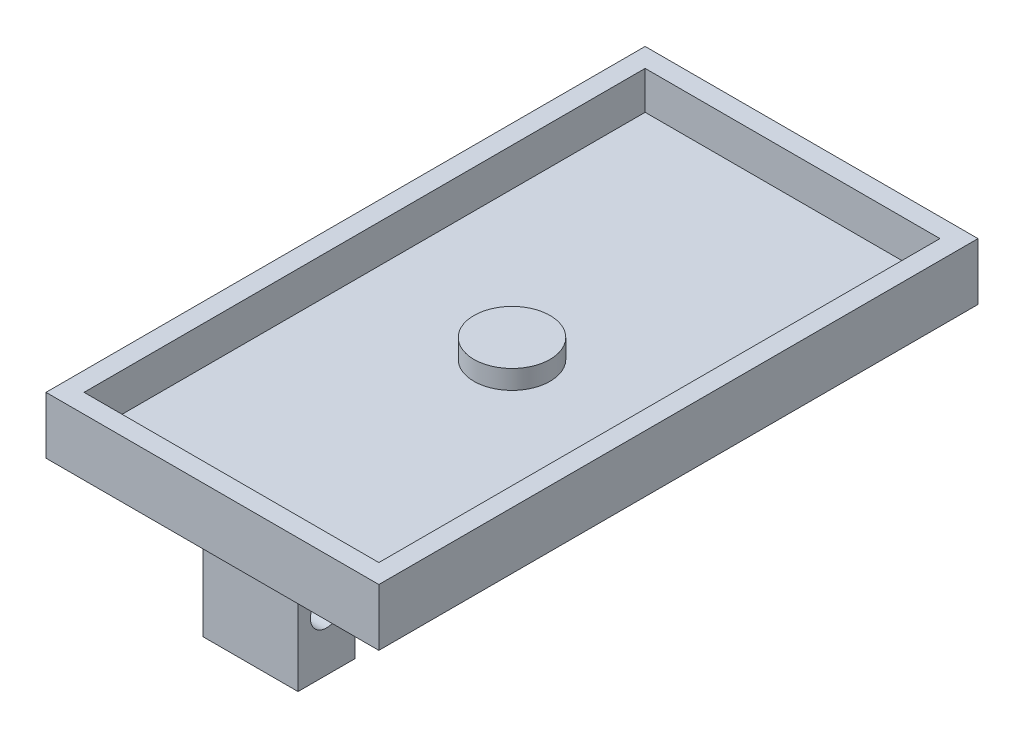
ISO-10303-21;
HEADER;
FILE_DESCRIPTION(('STEP AP214'),'2;1');
FILE_NAME('part.step','',(''),(''),'','','');
FILE_SCHEMA(('AUTOMOTIVE_DESIGN { 1 0 10303 214 1 1 1 1 }'));
ENDSEC;
DATA;
#1=APPLICATION_CONTEXT('core data for automotive mechanical design processes');
#2=APPLICATION_PROTOCOL_DEFINITION('international standard','automotive_design',2000,#1);
#3=PRODUCT_CONTEXT('',#1,'mechanical');
#4=PRODUCT('Part','Part','',(#3));
#5=PRODUCT_RELATED_PRODUCT_CATEGORY('part','',(#4));
#6=PRODUCT_DEFINITION_FORMATION('','',#4);
#7=PRODUCT_DEFINITION_CONTEXT('part definition',#1,'design');
#8=PRODUCT_DEFINITION('design','',#6,#7);
#9=PRODUCT_DEFINITION_SHAPE('','',#8);
#10=(LENGTH_UNIT() NAMED_UNIT(*) SI_UNIT(.MILLI.,.METRE.));
#11=(NAMED_UNIT(*) PLANE_ANGLE_UNIT() SI_UNIT($,.RADIAN.));
#12=(NAMED_UNIT(*) SI_UNIT($,.STERADIAN.) SOLID_ANGLE_UNIT());
#13=UNCERTAINTY_MEASURE_WITH_UNIT(LENGTH_MEASURE(1.E-05),#10,'distance_accuracy_value','');
#14=(GEOMETRIC_REPRESENTATION_CONTEXT(3) GLOBAL_UNCERTAINTY_ASSIGNED_CONTEXT((#13)) GLOBAL_UNIT_ASSIGNED_CONTEXT((#10,
#11,#12)) REPRESENTATION_CONTEXT('',''));
#15=CARTESIAN_POINT('',(0.,0.,0.));
#16=DIRECTION('',(0.,0.,1.));
#17=DIRECTION('',(1.,0.,0.));
#18=AXIS2_PLACEMENT_3D('',#15,#16,#17);
#19=CARTESIAN_POINT('',(17.5,2.,-31.5));
#20=DIRECTION('',(-1.,0.,0.));
#21=DIRECTION('',(0.,0.,1.));
#22=AXIS2_PLACEMENT_3D('',#19,#20,#21);
#23=PLANE('',#22);
#24=DIRECTION('',(0.,0.,-1.));
#25=VECTOR('',#24,1.);
#26=CARTESIAN_POINT('',(17.5,0.,-31.5));
#27=LINE('',#26,#25);
#28=CARTESIAN_POINT('',(17.5,0.,31.5));
#29=VERTEX_POINT('',#28);
#30=CARTESIAN_POINT('',(17.5,0.,-31.5));
#31=VERTEX_POINT('',#30);
#32=EDGE_CURVE('E328',#29,#31,#27,.T.);
#33=ORIENTED_EDGE('',*,*,#32,.T.);
#34=DIRECTION('',(0.,-1.,0.));
#35=VECTOR('',#34,1.);
#36=CARTESIAN_POINT('',(17.5,2.,-31.5));
#37=LINE('',#36,#35);
#38=CARTESIAN_POINT('',(17.5,6.,-31.5));
#39=VERTEX_POINT('',#38);
#40=EDGE_CURVE('E356',#39,#31,#37,.T.);
#41=ORIENTED_EDGE('',*,*,#40,.F.);
#42=DIRECTION('',(0.,0.,-1.));
#43=VECTOR('',#42,1.);
#44=CARTESIAN_POINT('',(17.5,6.,0.));
#45=LINE('',#44,#43);
#46=CARTESIAN_POINT('',(17.5,6.,31.5));
#47=VERTEX_POINT('',#46);
#48=EDGE_CURVE('E205',#47,#39,#45,.T.);
#49=ORIENTED_EDGE('',*,*,#48,.F.);
#50=DIRECTION('',(0.,-1.,0.));
#51=VECTOR('',#50,1.);
#52=CARTESIAN_POINT('',(17.5,2.,31.5));
#53=LINE('',#52,#51);
#54=EDGE_CURVE('E343',#47,#29,#53,.T.);
#55=ORIENTED_EDGE('',*,*,#54,.T.);
#56=EDGE_LOOP('',(#33,#41,#49,#55));
#57=FACE_BOUND('',#56,.T.);
#58=ADVANCED_FACE('F41',(#57),#23,.F.);
#59=CARTESIAN_POINT('',(-17.5,2.,-31.5));
#60=DIRECTION('',(0.,0.,1.));
#61=DIRECTION('',(1.,0.,0.));
#62=AXIS2_PLACEMENT_3D('',#59,#60,#61);
#63=PLANE('',#62);
#64=DIRECTION('',(-1.,0.,0.));
#65=VECTOR('',#64,1.);
#66=CARTESIAN_POINT('',(-17.5,0.,-31.5));
#67=LINE('',#66,#65);
#68=CARTESIAN_POINT('',(-17.5,0.,-31.5));
#69=VERTEX_POINT('',#68);
#70=EDGE_CURVE('E332',#31,#69,#67,.T.);
#71=ORIENTED_EDGE('',*,*,#70,.T.);
#72=DIRECTION('',(0.,-1.,0.));
#73=VECTOR('',#72,1.);
#74=CARTESIAN_POINT('',(-17.5,2.,-31.5));
#75=LINE('',#74,#73);
#76=CARTESIAN_POINT('',(-17.5,6.,-31.5));
#77=VERTEX_POINT('',#76);
#78=EDGE_CURVE('E352',#77,#69,#75,.T.);
#79=ORIENTED_EDGE('',*,*,#78,.F.);
#80=DIRECTION('',(-1.,0.,0.));
#81=VECTOR('',#80,1.);
#82=CARTESIAN_POINT('',(0.,6.,-31.5));
#83=LINE('',#82,#81);
#84=EDGE_CURVE('E209',#39,#77,#83,.T.);
#85=ORIENTED_EDGE('',*,*,#84,.F.);
#86=ORIENTED_EDGE('',*,*,#40,.T.);
#87=EDGE_LOOP('',(#71,#79,#85,#86));
#88=FACE_BOUND('',#87,.T.);
#89=ADVANCED_FACE('F429',(#88),#63,.F.);
#90=CARTESIAN_POINT('',(-17.5,2.,-31.5));
#91=DIRECTION('',(1.,0.,0.));
#92=DIRECTION('',(0.,0.,-1.));
#93=AXIS2_PLACEMENT_3D('',#90,#91,#92);
#94=PLANE('',#93);
#95=DIRECTION('',(0.,0.,1.));
#96=VECTOR('',#95,1.);
#97=CARTESIAN_POINT('',(-17.5,0.,-31.5));
#98=LINE('',#97,#96);
#99=CARTESIAN_POINT('',(-17.5,0.,31.5));
#100=VERTEX_POINT('',#99);
#101=EDGE_CURVE('E335',#69,#100,#98,.T.);
#102=ORIENTED_EDGE('',*,*,#101,.T.);
#103=DIRECTION('',(0.,-1.,0.));
#104=VECTOR('',#103,1.);
#105=CARTESIAN_POINT('',(-17.5,2.,31.5));
#106=LINE('',#105,#104);
#107=CARTESIAN_POINT('',(-17.5,6.,31.5));
#108=VERTEX_POINT('',#107);
#109=EDGE_CURVE('E348',#108,#100,#106,.T.);
#110=ORIENTED_EDGE('',*,*,#109,.F.);
#111=DIRECTION('',(0.,0.,1.));
#112=VECTOR('',#111,1.);
#113=CARTESIAN_POINT('',(-17.5,6.,0.));
#114=LINE('',#113,#112);
#115=EDGE_CURVE('E213',#77,#108,#114,.T.);
#116=ORIENTED_EDGE('',*,*,#115,.F.);
#117=ORIENTED_EDGE('',*,*,#78,.T.);
#118=EDGE_LOOP('',(#102,#110,#116,#117));
#119=FACE_BOUND('',#118,.T.);
#120=ADVANCED_FACE('F432',(#119),#94,.F.);
#121=CARTESIAN_POINT('',(-17.5,2.,31.5));
#122=DIRECTION('',(0.,0.,-1.));
#123=DIRECTION('',(-1.,0.,0.));
#124=AXIS2_PLACEMENT_3D('',#121,#122,#123);
#125=PLANE('',#124);
#126=DIRECTION('',(1.,0.,0.));
#127=VECTOR('',#126,1.);
#128=CARTESIAN_POINT('',(-17.5,0.,31.5));
#129=LINE('',#128,#127);
#130=CARTESIAN_POINT('',(-5.,0.,31.5));
#131=VERTEX_POINT('',#130);
#132=EDGE_CURVE('E339',#100,#131,#129,.T.);
#133=ORIENTED_EDGE('',*,*,#132,.T.);
#134=CARTESIAN_POINT('',(5.,0.,31.5));
#135=VERTEX_POINT('',#134);
#136=EDGE_CURVE('E344',#131,#135,#129,.T.);
#137=ORIENTED_EDGE('',*,*,#136,.T.);
#138=EDGE_CURVE('E338',#135,#29,#129,.T.);
#139=ORIENTED_EDGE('',*,*,#138,.T.);
#140=ORIENTED_EDGE('',*,*,#54,.F.);
#141=DIRECTION('',(1.,0.,0.));
#142=VECTOR('',#141,1.);
#143=CARTESIAN_POINT('',(0.,6.,31.5));
#144=LINE('',#143,#142);
#145=EDGE_CURVE('E201',#108,#47,#144,.T.);
#146=ORIENTED_EDGE('',*,*,#145,.F.);
#147=ORIENTED_EDGE('',*,*,#109,.T.);
#148=EDGE_LOOP('',(#133,#137,#139,#140,#146,#147));
#149=FACE_BOUND('',#148,.T.);
#150=ADVANCED_FACE('F406',(#149),#125,.F.);
#151=CARTESIAN_POINT('',(0.,0.,0.));
#152=DIRECTION('',(0.,1.,0.));
#153=DIRECTION('',(0.,0.,1.));
#154=AXIS2_PLACEMENT_3D('',#151,#152,#153);
#155=PLANE('',#154);
#156=DIRECTION('',(-1.,0.,0.));
#157=VECTOR('',#156,1.);
#158=CARTESIAN_POINT('',(0.,0.,-11.5));
#159=LINE('',#158,#157);
#160=CARTESIAN_POINT('',(5.,0.,-11.5));
#161=VERTEX_POINT('',#160);
#162=CARTESIAN_POINT('',(-5.,0.,-11.5));
#163=VERTEX_POINT('',#162);
#164=EDGE_CURVE('E364',#161,#163,#159,.T.);
#165=ORIENTED_EDGE('',*,*,#164,.T.);
#166=DIRECTION('',(0.,0.,-1.));
#167=VECTOR('',#166,1.);
#168=CARTESIAN_POINT('',(-5.,0.,0.));
#169=LINE('',#168,#167);
#170=CARTESIAN_POINT('',(-5.,0.,-1.50000000000001));
#171=VERTEX_POINT('',#170);
#172=EDGE_CURVE('E256',#171,#163,#169,.T.);
#173=ORIENTED_EDGE('',*,*,#172,.F.);
#174=DIRECTION('',(1.,0.,0.));
#175=VECTOR('',#174,1.);
#176=CARTESIAN_POINT('',(0.,0.,-1.50000000000001));
#177=LINE('',#176,#175);
#178=CARTESIAN_POINT('',(5.,0.,-1.50000000000001));
#179=VERTEX_POINT('',#178);
#180=EDGE_CURVE('E270',#171,#179,#177,.T.);
#181=ORIENTED_EDGE('',*,*,#180,.T.);
#182=DIRECTION('',(0.,0.,-1.));
#183=VECTOR('',#182,1.);
#184=CARTESIAN_POINT('',(5.,0.,0.));
#185=LINE('',#184,#183);
#186=EDGE_CURVE('E244',#179,#161,#185,.T.);
#187=ORIENTED_EDGE('',*,*,#186,.T.);
#188=EDGE_LOOP('',(#165,#173,#181,#187));
#189=FACE_BOUND('',#188,.T.);
#190=DIRECTION('',(0.,0.,1.));
#191=VECTOR('',#190,1.);
#192=CARTESIAN_POINT('',(-5.,0.,0.));
#193=LINE('',#192,#191);
#194=CARTESIAN_POINT('',(-5.,0.,21.5));
#195=VERTEX_POINT('',#194);
#196=EDGE_CURVE('E289',#195,#131,#193,.T.);
#197=ORIENTED_EDGE('',*,*,#196,.T.);
#198=ORIENTED_EDGE('',*,*,#132,.F.);
#199=ORIENTED_EDGE('',*,*,#101,.F.);
#200=ORIENTED_EDGE('',*,*,#70,.F.);
#201=ORIENTED_EDGE('',*,*,#32,.F.);
#202=ORIENTED_EDGE('',*,*,#138,.F.);
#203=DIRECTION('',(0.,0.,1.));
#204=VECTOR('',#203,1.);
#205=CARTESIAN_POINT('',(5.,0.,0.));
#206=LINE('',#205,#204);
#207=CARTESIAN_POINT('',(5.,0.,21.5));
#208=VERTEX_POINT('',#207);
#209=EDGE_CURVE('E295',#208,#135,#206,.T.);
#210=ORIENTED_EDGE('',*,*,#209,.F.);
#211=DIRECTION('',(1.,0.,0.));
#212=VECTOR('',#211,1.);
#213=CARTESIAN_POINT('',(0.,0.,21.5));
#214=LINE('',#213,#212);
#215=EDGE_CURVE('E307',#195,#208,#214,.T.);
#216=ORIENTED_EDGE('',*,*,#215,.F.);
#217=EDGE_LOOP('',(#197,#198,#199,#200,#201,#202,#210,#216));
#218=FACE_BOUND('',#217,.T.);
#219=ADVANCED_FACE('F402',(#189,#218),#155,.F.);
#220=CARTESIAN_POINT('',(-5.,-12.,0.));
#221=DIRECTION('',(-1.,0.,0.));
#222=DIRECTION('',(0.,0.,1.));
#223=AXIS2_PLACEMENT_3D('',#220,#221,#222);
#224=PLANE('',#223);
#225=CARTESIAN_POINT('',(-5.,-6.00000000000001,24.5));
#226=DIRECTION('',(1.,0.,0.));
#227=DIRECTION('',(0.,0.,-1.));
#228=AXIS2_PLACEMENT_3D('',#225,#226,#227);
#229=CIRCLE('',#228,1.7);
#230=CARTESIAN_POINT('',(-5.,-6.00000000000001,22.8));
#231=VERTEX_POINT('',#230);
#232=EDGE_CURVE('E240',#231,#231,#229,.F.);
#233=ORIENTED_EDGE('',*,*,#232,.F.);
#234=EDGE_LOOP('',(#233));
#235=FACE_BOUND('',#234,.T.);
#236=ORIENTED_EDGE('',*,*,#196,.F.);
#237=DIRECTION('',(0.,1.,0.));
#238=VECTOR('',#237,1.);
#239=CARTESIAN_POINT('',(-5.,-12.,21.5));
#240=LINE('',#239,#238);
#241=CARTESIAN_POINT('',(-5.,-12.,21.5));
#242=VERTEX_POINT('',#241);
#243=EDGE_CURVE('E324',#242,#195,#240,.T.);
#244=ORIENTED_EDGE('',*,*,#243,.F.);
#245=DIRECTION('',(0.,0.,1.));
#246=VECTOR('',#245,1.);
#247=CARTESIAN_POINT('',(-5.,-12.,0.));
#248=LINE('',#247,#246);
#249=CARTESIAN_POINT('',(-5.,-12.,27.5));
#250=VERTEX_POINT('',#249);
#251=EDGE_CURVE('E290',#242,#250,#248,.T.);
#252=ORIENTED_EDGE('',*,*,#251,.T.);
#253=DIRECTION('',(0.,1.,0.));
#254=VECTOR('',#253,1.);
#255=CARTESIAN_POINT('',(-5.,-12.,27.5));
#256=LINE('',#255,#254);
#257=CARTESIAN_POINT('',(-5.,-4.,27.5));
#258=VERTEX_POINT('',#257);
#259=EDGE_CURVE('E304',#250,#258,#256,.T.);
#260=ORIENTED_EDGE('',*,*,#259,.T.);
#261=CARTESIAN_POINT('',(-5.,-4.,31.5));
#262=DIRECTION('',(-1.,0.,0.));
#263=DIRECTION('',(0.,0.,1.));
#264=AXIS2_PLACEMENT_3D('',#261,#262,#263);
#265=CIRCLE('',#264,4.);
#266=EDGE_CURVE('E371',#258,#131,#265,.F.);
#267=ORIENTED_EDGE('',*,*,#266,.T.);
#268=EDGE_LOOP('',(#236,#244,#252,#260,#267));
#269=FACE_BOUND('',#268,.T.);
#270=ADVANCED_FACE('F405',(#235,#269),#224,.T.);
#271=CARTESIAN_POINT('',(0.,-12.,21.5));
#272=DIRECTION('',(0.,0.,1.));
#273=DIRECTION('',(1.,0.,0.));
#274=AXIS2_PLACEMENT_3D('',#271,#272,#273);
#275=PLANE('',#274);
#276=ORIENTED_EDGE('',*,*,#215,.T.);
#277=DIRECTION('',(0.,1.,0.));
#278=VECTOR('',#277,1.);
#279=CARTESIAN_POINT('',(5.,-12.,21.5));
#280=LINE('',#279,#278);
#281=CARTESIAN_POINT('',(5.,-12.,21.5));
#282=VERTEX_POINT('',#281);
#283=EDGE_CURVE('E320',#282,#208,#280,.T.);
#284=ORIENTED_EDGE('',*,*,#283,.F.);
#285=DIRECTION('',(1.,0.,0.));
#286=VECTOR('',#285,1.);
#287=CARTESIAN_POINT('',(0.,-12.,21.5));
#288=LINE('',#287,#286);
#289=EDGE_CURVE('E294',#242,#282,#288,.T.);
#290=ORIENTED_EDGE('',*,*,#289,.F.);
#291=ORIENTED_EDGE('',*,*,#243,.T.);
#292=EDGE_LOOP('',(#276,#284,#290,#291));
#293=FACE_BOUND('',#292,.T.);
#294=ADVANCED_FACE('F485',(#293),#275,.F.);
#295=CARTESIAN_POINT('',(5.,-12.,0.));
#296=DIRECTION('',(-1.,0.,0.));
#297=DIRECTION('',(0.,0.,1.));
#298=AXIS2_PLACEMENT_3D('',#295,#296,#297);
#299=PLANE('',#298);
#300=CARTESIAN_POINT('',(5.,-6.00000000000001,24.5));
#301=DIRECTION('',(1.,0.,0.));
#302=DIRECTION('',(0.,0.,-1.));
#303=AXIS2_PLACEMENT_3D('',#300,#301,#302);
#304=CIRCLE('',#303,1.7);
#305=CARTESIAN_POINT('',(5.,-6.00000000000001,22.8));
#306=VERTEX_POINT('',#305);
#307=EDGE_CURVE('E176',#306,#306,#304,.T.);
#308=ORIENTED_EDGE('',*,*,#307,.F.);
#309=EDGE_LOOP('',(#308));
#310=FACE_BOUND('',#309,.T.);
#311=ORIENTED_EDGE('',*,*,#209,.T.);
#312=CARTESIAN_POINT('',(5.,-4.,31.5));
#313=DIRECTION('',(-1.,0.,0.));
#314=DIRECTION('',(0.,0.,1.));
#315=AXIS2_PLACEMENT_3D('',#312,#313,#314);
#316=CIRCLE('',#315,4.);
#317=CARTESIAN_POINT('',(5.,-4.,27.5));
#318=VERTEX_POINT('',#317);
#319=EDGE_CURVE('E375',#135,#318,#316,.T.);
#320=ORIENTED_EDGE('',*,*,#319,.T.);
#321=DIRECTION('',(0.,1.,0.));
#322=VECTOR('',#321,1.);
#323=CARTESIAN_POINT('',(5.,-12.,27.5));
#324=LINE('',#323,#322);
#325=CARTESIAN_POINT('',(5.,-12.,27.5));
#326=VERTEX_POINT('',#325);
#327=EDGE_CURVE('E316',#326,#318,#324,.T.);
#328=ORIENTED_EDGE('',*,*,#327,.F.);
#329=DIRECTION('',(0.,0.,1.));
#330=VECTOR('',#329,1.);
#331=CARTESIAN_POINT('',(5.,-12.,0.));
#332=LINE('',#331,#330);
#333=EDGE_CURVE('E298',#282,#326,#332,.T.);
#334=ORIENTED_EDGE('',*,*,#333,.F.);
#335=ORIENTED_EDGE('',*,*,#283,.T.);
#336=EDGE_LOOP('',(#311,#320,#328,#334,#335));
#337=FACE_BOUND('',#336,.T.);
#338=ADVANCED_FACE('F481',(#310,#337),#299,.F.);
#339=CARTESIAN_POINT('',(0.,-12.,27.5));
#340=DIRECTION('',(0.,0.,-1.));
#341=DIRECTION('',(-1.,0.,0.));
#342=AXIS2_PLACEMENT_3D('',#339,#340,#341);
#343=PLANE('',#342);
#344=ORIENTED_EDGE('',*,*,#327,.T.);
#345=DIRECTION('',(-1.,0.,0.));
#346=VECTOR('',#345,1.);
#347=CARTESIAN_POINT('',(-5.,-4.,27.5));
#348=LINE('',#347,#346);
#349=EDGE_CURVE('E360',#318,#258,#348,.T.);
#350=ORIENTED_EDGE('',*,*,#349,.T.);
#351=ORIENTED_EDGE('',*,*,#259,.F.);
#352=DIRECTION('',(-1.,0.,0.));
#353=VECTOR('',#352,1.);
#354=CARTESIAN_POINT('',(0.,-12.,27.5));
#355=LINE('',#354,#353);
#356=EDGE_CURVE('E301',#326,#250,#355,.T.);
#357=ORIENTED_EDGE('',*,*,#356,.F.);
#358=EDGE_LOOP('',(#344,#350,#351,#357));
#359=FACE_BOUND('',#358,.T.);
#360=ADVANCED_FACE('F477',(#359),#343,.F.);
#361=CARTESIAN_POINT('',(0.,-12.,0.));
#362=DIRECTION('',(0.,-1.,0.));
#363=DIRECTION('',(0.,0.,-1.));
#364=AXIS2_PLACEMENT_3D('',#361,#362,#363);
#365=PLANE('',#364);
#366=ORIENTED_EDGE('',*,*,#251,.F.);
#367=ORIENTED_EDGE('',*,*,#289,.T.);
#368=ORIENTED_EDGE('',*,*,#333,.T.);
#369=ORIENTED_EDGE('',*,*,#356,.T.);
#370=EDGE_LOOP('',(#366,#367,#368,#369));
#371=FACE_BOUND('',#370,.T.);
#372=ADVANCED_FACE('F473',(#371),#365,.T.);
#373=CARTESIAN_POINT('',(5.,-12.,0.));
#374=DIRECTION('',(1.,0.,0.));
#375=DIRECTION('',(0.,0.,-1.));
#376=AXIS2_PLACEMENT_3D('',#373,#374,#375);
#377=PLANE('',#376);
#378=CARTESIAN_POINT('',(5.,-6.00000000000001,-4.5));
#379=DIRECTION('',(1.,0.,0.));
#380=DIRECTION('',(0.,0.,-1.));
#381=AXIS2_PLACEMENT_3D('',#378,#379,#380);
#382=CIRCLE('',#381,1.7);
#383=CARTESIAN_POINT('',(5.,-6.00000000000001,-6.2));
#384=VERTEX_POINT('',#383);
#385=EDGE_CURVE('E235',#384,#384,#382,.T.);
#386=ORIENTED_EDGE('',*,*,#385,.F.);
#387=EDGE_LOOP('',(#386));
#388=FACE_BOUND('',#387,.T.);
#389=ORIENTED_EDGE('',*,*,#186,.F.);
#390=DIRECTION('',(0.,1.,0.));
#391=VECTOR('',#390,1.);
#392=CARTESIAN_POINT('',(5.,-12.,-1.50000000000001));
#393=LINE('',#392,#391);
#394=CARTESIAN_POINT('',(5.,-12.,-1.50000000000001));
#395=VERTEX_POINT('',#394);
#396=EDGE_CURVE('E286',#395,#179,#393,.T.);
#397=ORIENTED_EDGE('',*,*,#396,.F.);
#398=DIRECTION('',(0.,0.,-1.));
#399=VECTOR('',#398,1.);
#400=CARTESIAN_POINT('',(5.,-12.,0.));
#401=LINE('',#400,#399);
#402=CARTESIAN_POINT('',(5.,-12.,-7.5));
#403=VERTEX_POINT('',#402);
#404=EDGE_CURVE('E251',#395,#403,#401,.T.);
#405=ORIENTED_EDGE('',*,*,#404,.T.);
#406=DIRECTION('',(0.,1.,0.));
#407=VECTOR('',#406,1.);
#408=CARTESIAN_POINT('',(5.,-12.,-7.5));
#409=LINE('',#408,#407);
#410=CARTESIAN_POINT('',(5.,-4.,-7.5));
#411=VERTEX_POINT('',#410);
#412=EDGE_CURVE('E267',#403,#411,#409,.T.);
#413=ORIENTED_EDGE('',*,*,#412,.T.);
#414=CARTESIAN_POINT('',(5.,-4.,-11.5));
#415=DIRECTION('',(1.,0.,0.));
#416=DIRECTION('',(0.,0.,-1.));
#417=AXIS2_PLACEMENT_3D('',#414,#415,#416);
#418=CIRCLE('',#417,4.);
#419=EDGE_CURVE('E11',#411,#161,#418,.F.);
#420=ORIENTED_EDGE('',*,*,#419,.T.);
#421=EDGE_LOOP('',(#389,#397,#405,#413,#420));
#422=FACE_BOUND('',#421,.T.);
#423=ADVANCED_FACE('F393',(#388,#422),#377,.T.);
#424=CARTESIAN_POINT('',(0.,-12.,-1.50000000000001));
#425=DIRECTION('',(0.,0.,1.));
#426=DIRECTION('',(1.,0.,0.));
#427=AXIS2_PLACEMENT_3D('',#424,#425,#426);
#428=PLANE('',#427);
#429=ORIENTED_EDGE('',*,*,#180,.F.);
#430=DIRECTION('',(0.,1.,0.));
#431=VECTOR('',#430,1.);
#432=CARTESIAN_POINT('',(-5.,-12.,-1.50000000000001));
#433=LINE('',#432,#431);
#434=CARTESIAN_POINT('',(-5.,-12.,-1.50000000000001));
#435=VERTEX_POINT('',#434);
#436=EDGE_CURVE('E283',#435,#171,#433,.T.);
#437=ORIENTED_EDGE('',*,*,#436,.F.);
#438=DIRECTION('',(1.,0.,0.));
#439=VECTOR('',#438,1.);
#440=CARTESIAN_POINT('',(0.,-12.,-1.50000000000001));
#441=LINE('',#440,#439);
#442=EDGE_CURVE('E255',#435,#395,#441,.T.);
#443=ORIENTED_EDGE('',*,*,#442,.T.);
#444=ORIENTED_EDGE('',*,*,#396,.T.);
#445=EDGE_LOOP('',(#429,#437,#443,#444));
#446=FACE_BOUND('',#445,.T.);
#447=ADVANCED_FACE('F400',(#446),#428,.T.);
#448=CARTESIAN_POINT('',(-5.,-12.,0.));
#449=DIRECTION('',(1.,0.,0.));
#450=DIRECTION('',(0.,0.,-1.));
#451=AXIS2_PLACEMENT_3D('',#448,#449,#450);
#452=PLANE('',#451);
#453=CARTESIAN_POINT('',(-5.,-6.00000000000001,-4.5));
#454=DIRECTION('',(1.,0.,0.));
#455=DIRECTION('',(0.,0.,-1.));
#456=AXIS2_PLACEMENT_3D('',#453,#454,#455);
#457=CIRCLE('',#456,1.7);
#458=CARTESIAN_POINT('',(-5.,-6.00000000000001,-6.2));
#459=VERTEX_POINT('',#458);
#460=EDGE_CURVE('E239',#459,#459,#457,.F.);
#461=ORIENTED_EDGE('',*,*,#460,.F.);
#462=EDGE_LOOP('',(#461));
#463=FACE_BOUND('',#462,.T.);
#464=ORIENTED_EDGE('',*,*,#172,.T.);
#465=CARTESIAN_POINT('',(-5.,-4.,-11.5));
#466=DIRECTION('',(1.,0.,0.));
#467=DIRECTION('',(0.,0.,-1.));
#468=AXIS2_PLACEMENT_3D('',#465,#466,#467);
#469=CIRCLE('',#468,4.);
#470=CARTESIAN_POINT('',(-5.,-4.,-7.5));
#471=VERTEX_POINT('',#470);
#472=EDGE_CURVE('E50',#163,#471,#469,.T.);
#473=ORIENTED_EDGE('',*,*,#472,.T.);
#474=DIRECTION('',(0.,1.,0.));
#475=VECTOR('',#474,1.);
#476=CARTESIAN_POINT('',(-5.,-12.,-7.5));
#477=LINE('',#476,#475);
#478=CARTESIAN_POINT('',(-5.,-12.,-7.5));
#479=VERTEX_POINT('',#478);
#480=EDGE_CURVE('E279',#479,#471,#477,.T.);
#481=ORIENTED_EDGE('',*,*,#480,.F.);
#482=DIRECTION('',(0.,0.,-1.));
#483=VECTOR('',#482,1.);
#484=CARTESIAN_POINT('',(-5.,-12.,0.));
#485=LINE('',#484,#483);
#486=EDGE_CURVE('E260',#435,#479,#485,.T.);
#487=ORIENTED_EDGE('',*,*,#486,.F.);
#488=ORIENTED_EDGE('',*,*,#436,.T.);
#489=EDGE_LOOP('',(#464,#473,#481,#487,#488));
#490=FACE_BOUND('',#489,.T.);
#491=ADVANCED_FACE('F381',(#463,#490),#452,.F.);
#492=CARTESIAN_POINT('',(0.,-12.,-7.5));
#493=DIRECTION('',(0.,0.,-1.));
#494=DIRECTION('',(-1.,0.,0.));
#495=AXIS2_PLACEMENT_3D('',#492,#493,#494);
#496=PLANE('',#495);
#497=ORIENTED_EDGE('',*,*,#480,.T.);
#498=DIRECTION('',(-1.,0.,0.));
#499=VECTOR('',#498,1.);
#500=CARTESIAN_POINT('',(0.,-4.,-7.5));
#501=LINE('',#500,#499);
#502=EDGE_CURVE('E368',#471,#411,#501,.F.);
#503=ORIENTED_EDGE('',*,*,#502,.T.);
#504=ORIENTED_EDGE('',*,*,#412,.F.);
#505=DIRECTION('',(-1.,0.,0.));
#506=VECTOR('',#505,1.);
#507=CARTESIAN_POINT('',(0.,-12.,-7.5));
#508=LINE('',#507,#506);
#509=EDGE_CURVE('E263',#403,#479,#508,.T.);
#510=ORIENTED_EDGE('',*,*,#509,.T.);
#511=EDGE_LOOP('',(#497,#503,#504,#510));
#512=FACE_BOUND('',#511,.T.);
#513=ADVANCED_FACE('F388',(#512),#496,.T.);
#514=CARTESIAN_POINT('',(0.,-12.,0.));
#515=DIRECTION('',(0.,-1.,0.));
#516=DIRECTION('',(0.,0.,-1.));
#517=AXIS2_PLACEMENT_3D('',#514,#515,#516);
#518=PLANE('',#517);
#519=ORIENTED_EDGE('',*,*,#404,.F.);
#520=ORIENTED_EDGE('',*,*,#442,.F.);
#521=ORIENTED_EDGE('',*,*,#486,.T.);
#522=ORIENTED_EDGE('',*,*,#509,.F.);
#523=EDGE_LOOP('',(#519,#520,#521,#522));
#524=FACE_BOUND('',#523,.T.);
#525=ADVANCED_FACE('F397',(#524),#518,.T.);
#526=CARTESIAN_POINT('',(-9.80832611206852,-6.00000000000001,-4.50000000000001));
#527=DIRECTION('',(1.,0.,0.));
#528=DIRECTION('',(0.,0.,-1.));
#529=AXIS2_PLACEMENT_3D('',#526,#527,#528);
#530=CYLINDRICAL_SURFACE('',#529,1.7);
#531=CARTESIAN_POINT('',(-5.,-6.00000000000001,-6.2));
#532=CARTESIAN_POINT('',(-4.89583333333334,-6.00000000000001,-6.2));
#533=CARTESIAN_POINT('',(-4.79166666666667,-6.00000000000001,-6.2));
#534=CARTESIAN_POINT('',(-4.58333333333333,-6.00000000000001,-6.2));
#535=CARTESIAN_POINT('',(-4.47916666666667,-6.00000000000001,-6.2));
#536=CARTESIAN_POINT('',(-4.27083333333333,-6.00000000000001,-6.2));
#537=CARTESIAN_POINT('',(-4.16666666666667,-6.00000000000001,-6.2));
#538=CARTESIAN_POINT('',(-3.95833333333333,-6.00000000000001,-6.2));
#539=CARTESIAN_POINT('',(-3.85416666666667,-6.00000000000001,-6.2));
#540=CARTESIAN_POINT('',(-3.64583333333333,-6.00000000000001,-6.2));
#541=CARTESIAN_POINT('',(-3.54166666666667,-6.00000000000001,-6.2));
#542=CARTESIAN_POINT('',(-3.33333333333333,-6.00000000000001,-6.2));
#543=CARTESIAN_POINT('',(-3.22916666666667,-6.00000000000001,-6.2));
#544=CARTESIAN_POINT('',(-3.02083333333333,-6.00000000000001,-6.2));
#545=CARTESIAN_POINT('',(-2.91666666666667,-6.00000000000001,-6.2));
#546=CARTESIAN_POINT('',(-2.70833333333333,-6.00000000000001,-6.2));
#547=CARTESIAN_POINT('',(-2.60416666666667,-6.00000000000001,-6.2));
#548=CARTESIAN_POINT('',(-2.39583333333333,-6.00000000000001,-6.2));
#549=CARTESIAN_POINT('',(-2.29166666666667,-6.00000000000001,-6.2));
#550=CARTESIAN_POINT('',(-2.08333333333333,-6.00000000000001,-6.2));
#551=CARTESIAN_POINT('',(-1.97916666666667,-6.00000000000001,-6.2));
#552=CARTESIAN_POINT('',(-1.77083333333333,-6.00000000000001,-6.2));
#553=CARTESIAN_POINT('',(-1.66666666666667,-6.00000000000001,-6.2));
#554=CARTESIAN_POINT('',(-1.45833333333333,-6.00000000000001,-6.2));
#555=CARTESIAN_POINT('',(-1.35416666666667,-6.00000000000001,-6.2));
#556=CARTESIAN_POINT('',(-1.14583333333333,-6.00000000000001,-6.2));
#557=CARTESIAN_POINT('',(-1.04166666666667,-6.00000000000001,-6.2));
#558=CARTESIAN_POINT('',(-0.833333333333334,-6.00000000000001,-6.2));
#559=CARTESIAN_POINT('',(-0.729166666666667,-6.00000000000001,-6.2));
#560=CARTESIAN_POINT('',(-0.520833333333334,-6.00000000000001,-6.2));
#561=CARTESIAN_POINT('',(-0.416666666666667,-6.00000000000001,-6.2));
#562=CARTESIAN_POINT('',(-0.208333333333334,-6.00000000000001,-6.2));
#563=CARTESIAN_POINT('',(-0.104166666666667,-6.00000000000001,-6.2));
#564=CARTESIAN_POINT('',(0.104166666666667,-6.00000000000001,-6.2));
#565=CARTESIAN_POINT('',(0.208333333333334,-6.00000000000001,-6.2));
#566=CARTESIAN_POINT('',(0.416666666666667,-6.00000000000001,-6.2));
#567=CARTESIAN_POINT('',(0.520833333333334,-6.00000000000001,-6.2));
#568=CARTESIAN_POINT('',(0.729166666666667,-6.00000000000001,-6.2));
#569=CARTESIAN_POINT('',(0.833333333333334,-6.00000000000001,-6.2));
#570=CARTESIAN_POINT('',(1.04166666666667,-6.00000000000001,-6.2));
#571=CARTESIAN_POINT('',(1.14583333333333,-6.00000000000001,-6.2));
#572=CARTESIAN_POINT('',(1.35416666666667,-6.00000000000001,-6.2));
#573=CARTESIAN_POINT('',(1.45833333333333,-6.00000000000001,-6.2));
#574=CARTESIAN_POINT('',(1.66666666666667,-6.00000000000001,-6.2));
#575=CARTESIAN_POINT('',(1.77083333333333,-6.00000000000001,-6.2));
#576=CARTESIAN_POINT('',(1.97916666666667,-6.00000000000001,-6.2));
#577=CARTESIAN_POINT('',(2.08333333333333,-6.00000000000001,-6.2));
#578=CARTESIAN_POINT('',(2.29166666666667,-6.00000000000001,-6.2));
#579=CARTESIAN_POINT('',(2.39583333333333,-6.00000000000001,-6.2));
#580=CARTESIAN_POINT('',(2.60416666666667,-6.00000000000001,-6.2));
#581=CARTESIAN_POINT('',(2.70833333333333,-6.00000000000001,-6.2));
#582=CARTESIAN_POINT('',(2.91666666666667,-6.00000000000001,-6.2));
#583=CARTESIAN_POINT('',(3.02083333333333,-6.00000000000001,-6.2));
#584=CARTESIAN_POINT('',(3.22916666666667,-6.00000000000001,-6.2));
#585=CARTESIAN_POINT('',(3.33333333333333,-6.00000000000001,-6.2));
#586=CARTESIAN_POINT('',(3.54166666666667,-6.00000000000001,-6.2));
#587=CARTESIAN_POINT('',(3.64583333333333,-6.00000000000001,-6.2));
#588=CARTESIAN_POINT('',(3.85416666666667,-6.00000000000001,-6.2));
#589=CARTESIAN_POINT('',(3.95833333333334,-6.00000000000001,-6.2));
#590=CARTESIAN_POINT('',(4.16666666666667,-6.00000000000001,-6.2));
#591=CARTESIAN_POINT('',(4.27083333333334,-6.00000000000001,-6.2));
#592=CARTESIAN_POINT('',(4.47916666666667,-6.00000000000001,-6.2));
#593=CARTESIAN_POINT('',(4.58333333333334,-6.00000000000001,-6.2));
#594=CARTESIAN_POINT('',(4.79166666666667,-6.00000000000001,-6.2));
#595=CARTESIAN_POINT('',(4.89583333333334,-6.00000000000001,-6.2));
#596=CARTESIAN_POINT('',(5.,-6.00000000000001,-6.2));
#597=B_SPLINE_CURVE_WITH_KNOTS('',3,(#531,#532,#533,#534,#535,#536,#537,#538,#539,#540,#541,
#542,#543,#544,#545,#546,#547,#548,#549,#550,#551,#552,#553,#554,#555,#556,#557,#558,#559,#560,
#561,#562,#563,#564,#565,#566,#567,#568,#569,#570,#571,#572,#573,#574,#575,#576,#577,#578,#579,
#580,#581,#582,#583,#584,#585,#586,#587,#588,#589,#590,#591,#592,#593,#594,#595,#596),
.UNSPECIFIED.,.F.,.F.,(4,2,2,2,2,2,2,2,2,2,2,2,2,2,2,2,2,2,2,2,2,2,2,2,2,2,2,2,2,2,2,2,4),(0.,
0.3125,0.625000000000001,0.937500000000001,1.25,1.5625,1.875,2.1875,2.5,2.8125,3.125,3.4375,
3.75,4.0625,4.375,4.6875,5.,5.3125,5.625,5.9375,6.25,6.5625,6.875,7.1875,7.5,7.8125,8.125,
8.4375,8.75,9.06250000000001,9.37500000000001,9.68750000000001,10.),.UNSPECIFIED.);
#598=EDGE_CURVE('BSEAM451',#459,#384,#597,.T.);
#599=ORIENTED_EDGE('',*,*,#460,.T.);
#600=ORIENTED_EDGE('',*,*,#385,.T.);
#601=ORIENTED_EDGE('',*,*,#598,.T.);
#602=ORIENTED_EDGE('',*,*,#598,.F.);
#603=EDGE_LOOP('',(#599,#601,#600,#602));
#604=FACE_BOUND('',#603,.T.);
#605=ADVANCED_FACE('F451',(#604),#530,.F.);
#606=CARTESIAN_POINT('',(-9.80832611206852,-6.00000000000001,24.5));
#607=DIRECTION('',(1.,0.,0.));
#608=DIRECTION('',(0.,0.,-1.));
#609=AXIS2_PLACEMENT_3D('',#606,#607,#608);
#610=CYLINDRICAL_SURFACE('',#609,1.7);
#611=CARTESIAN_POINT('',(-5.,-6.00000000000001,22.8));
#612=CARTESIAN_POINT('',(-4.89583333333333,-6.00000000000001,22.8));
#613=CARTESIAN_POINT('',(-4.79166666666666,-6.00000000000001,22.8));
#614=CARTESIAN_POINT('',(-4.58333333333333,-6.00000000000001,22.8));
#615=CARTESIAN_POINT('',(-4.47916666666666,-6.00000000000001,22.8));
#616=CARTESIAN_POINT('',(-4.27083333333333,-6.00000000000001,22.8));
#617=CARTESIAN_POINT('',(-4.16666666666666,-6.00000000000001,22.8));
#618=CARTESIAN_POINT('',(-3.95833333333333,-6.00000000000001,22.8));
#619=CARTESIAN_POINT('',(-3.85416666666666,-6.00000000000001,22.8));
#620=CARTESIAN_POINT('',(-3.64583333333333,-6.00000000000001,22.8));
#621=CARTESIAN_POINT('',(-3.54166666666666,-6.00000000000001,22.8));
#622=CARTESIAN_POINT('',(-3.33333333333333,-6.00000000000001,22.8));
#623=CARTESIAN_POINT('',(-3.22916666666666,-6.00000000000001,22.8));
#624=CARTESIAN_POINT('',(-3.02083333333333,-6.00000000000001,22.8));
#625=CARTESIAN_POINT('',(-2.91666666666667,-6.00000000000001,22.8));
#626=CARTESIAN_POINT('',(-2.70833333333333,-6.00000000000001,22.8));
#627=CARTESIAN_POINT('',(-2.60416666666666,-6.00000000000001,22.8));
#628=CARTESIAN_POINT('',(-2.39583333333333,-6.00000000000001,22.8));
#629=CARTESIAN_POINT('',(-2.29166666666666,-6.00000000000001,22.8));
#630=CARTESIAN_POINT('',(-2.08333333333333,-6.00000000000001,22.8));
#631=CARTESIAN_POINT('',(-1.97916666666667,-6.00000000000001,22.8));
#632=CARTESIAN_POINT('',(-1.77083333333333,-6.00000000000001,22.8));
#633=CARTESIAN_POINT('',(-1.66666666666667,-6.00000000000001,22.8));
#634=CARTESIAN_POINT('',(-1.45833333333333,-6.00000000000001,22.8));
#635=CARTESIAN_POINT('',(-1.35416666666667,-6.00000000000001,22.8));
#636=CARTESIAN_POINT('',(-1.14583333333333,-6.00000000000001,22.8));
#637=CARTESIAN_POINT('',(-1.04166666666667,-6.00000000000001,22.8));
#638=CARTESIAN_POINT('',(-0.833333333333333,-6.00000000000001,22.8));
#639=CARTESIAN_POINT('',(-0.729166666666667,-6.00000000000001,22.8));
#640=CARTESIAN_POINT('',(-0.520833333333334,-6.00000000000001,22.8));
#641=CARTESIAN_POINT('',(-0.416666666666667,-6.00000000000001,22.8));
#642=CARTESIAN_POINT('',(-0.208333333333334,-6.00000000000001,22.8));
#643=CARTESIAN_POINT('',(-0.104166666666668,-6.00000000000001,22.8));
#644=CARTESIAN_POINT('',(0.104166666666665,-6.00000000000001,22.8));
#645=CARTESIAN_POINT('',(0.208333333333332,-6.00000000000001,22.8));
#646=CARTESIAN_POINT('',(0.416666666666665,-6.00000000000001,22.8));
#647=CARTESIAN_POINT('',(0.520833333333332,-6.00000000000001,22.8));
#648=CARTESIAN_POINT('',(0.729166666666666,-6.00000000000001,22.8));
#649=CARTESIAN_POINT('',(0.833333333333332,-6.00000000000001,22.8));
#650=CARTESIAN_POINT('',(1.04166666666667,-6.00000000000001,22.8));
#651=CARTESIAN_POINT('',(1.14583333333333,-6.00000000000001,22.8));
#652=CARTESIAN_POINT('',(1.35416666666667,-6.00000000000001,22.8));
#653=CARTESIAN_POINT('',(1.45833333333333,-6.00000000000001,22.8));
#654=CARTESIAN_POINT('',(1.66666666666666,-6.00000000000001,22.8));
#655=CARTESIAN_POINT('',(1.77083333333333,-6.00000000000001,22.8));
#656=CARTESIAN_POINT('',(1.97916666666666,-6.00000000000001,22.8));
#657=CARTESIAN_POINT('',(2.08333333333333,-6.00000000000001,22.8));
#658=CARTESIAN_POINT('',(2.29166666666666,-6.00000000000001,22.8));
#659=CARTESIAN_POINT('',(2.39583333333333,-6.00000000000001,22.8));
#660=CARTESIAN_POINT('',(2.60416666666666,-6.00000000000001,22.8));
#661=CARTESIAN_POINT('',(2.70833333333333,-6.00000000000001,22.8));
#662=CARTESIAN_POINT('',(2.91666666666666,-6.00000000000001,22.8));
#663=CARTESIAN_POINT('',(3.02083333333333,-6.00000000000001,22.8));
#664=CARTESIAN_POINT('',(3.22916666666666,-6.00000000000001,22.8));
#665=CARTESIAN_POINT('',(3.33333333333333,-6.00000000000001,22.8));
#666=CARTESIAN_POINT('',(3.54166666666666,-6.00000000000001,22.8));
#667=CARTESIAN_POINT('',(3.64583333333333,-6.00000000000001,22.8));
#668=CARTESIAN_POINT('',(3.85416666666666,-6.00000000000001,22.8));
#669=CARTESIAN_POINT('',(3.95833333333333,-6.00000000000001,22.8));
#670=CARTESIAN_POINT('',(4.16666666666666,-6.00000000000001,22.8));
#671=CARTESIAN_POINT('',(4.27083333333333,-6.00000000000001,22.8));
#672=CARTESIAN_POINT('',(4.47916666666666,-6.00000000000001,22.8));
#673=CARTESIAN_POINT('',(4.58333333333333,-6.00000000000001,22.8));
#674=CARTESIAN_POINT('',(4.79166666666666,-6.00000000000001,22.8));
#675=CARTESIAN_POINT('',(4.89583333333333,-6.00000000000001,22.8));
#676=CARTESIAN_POINT('',(5.,-6.00000000000001,22.8));
#677=B_SPLINE_CURVE_WITH_KNOTS('',3,(#611,#612,#613,#614,#615,#616,#617,#618,#619,#620,#621,
#622,#623,#624,#625,#626,#627,#628,#629,#630,#631,#632,#633,#634,#635,#636,#637,#638,#639,#640,
#641,#642,#643,#644,#645,#646,#647,#648,#649,#650,#651,#652,#653,#654,#655,#656,#657,#658,#659,
#660,#661,#662,#663,#664,#665,#666,#667,#668,#669,#670,#671,#672,#673,#674,#675,#676),
.UNSPECIFIED.,.F.,.F.,(4,2,2,2,2,2,2,2,2,2,2,2,2,2,2,2,2,2,2,2,2,2,2,2,2,2,2,2,2,2,2,2,4),(0.,
0.312499999999999,0.625,0.937499999999999,1.25,1.5625,1.875,2.1875,2.5,2.8125,3.125,3.4375,3.75,
4.0625,4.375,4.6875,4.99999999999999,5.3125,5.625,5.9375,6.25,6.56249999999999,6.87499999999999,
7.18749999999999,7.49999999999999,7.81249999999999,8.12499999999999,8.43749999999999,
8.74999999999999,9.06249999999999,9.37499999999999,9.68749999999999,9.99999999999999),.UNSPECIFIED.);
#678=EDGE_CURVE('BSEAM446',#231,#306,#677,.T.);
#679=ORIENTED_EDGE('',*,*,#232,.T.);
#680=ORIENTED_EDGE('',*,*,#307,.T.);
#681=ORIENTED_EDGE('',*,*,#678,.T.);
#682=ORIENTED_EDGE('',*,*,#678,.F.);
#683=EDGE_LOOP('',(#679,#681,#680,#682));
#684=FACE_BOUND('',#683,.T.);
#685=ADVANCED_FACE('F446',(#684),#610,.F.);
#686=CARTESIAN_POINT('',(0.,-4.,31.5));
#687=DIRECTION('',(1.,0.,0.));
#688=DIRECTION('',(0.,0.,-1.));
#689=AXIS2_PLACEMENT_3D('',#686,#687,#688);
#690=CYLINDRICAL_SURFACE('',#689,4.);
#691=ORIENTED_EDGE('',*,*,#319,.F.);
#692=ORIENTED_EDGE('',*,*,#136,.F.);
#693=ORIENTED_EDGE('',*,*,#266,.F.);
#694=ORIENTED_EDGE('',*,*,#349,.F.);
#695=EDGE_LOOP('',(#691,#692,#693,#694));
#696=FACE_BOUND('',#695,.T.);
#697=ADVANCED_FACE('F420',(#696),#690,.F.);
#698=CARTESIAN_POINT('',(0.,-4.,-11.5));
#699=DIRECTION('',(-1.,0.,0.));
#700=DIRECTION('',(0.,0.,1.));
#701=AXIS2_PLACEMENT_3D('',#698,#699,#700);
#702=CYLINDRICAL_SURFACE('',#701,4.);
#703=ORIENTED_EDGE('',*,*,#419,.F.);
#704=ORIENTED_EDGE('',*,*,#502,.F.);
#705=ORIENTED_EDGE('',*,*,#472,.F.);
#706=ORIENTED_EDGE('',*,*,#164,.F.);
#707=EDGE_LOOP('',(#703,#704,#705,#706));
#708=FACE_BOUND('',#707,.T.);
#709=ADVANCED_FACE('F43',(#708),#702,.F.);
#710=CARTESIAN_POINT('',(0.,6.,29.5));
#711=DIRECTION('',(0.,0.,-1.));
#712=DIRECTION('',(-1.,0.,0.));
#713=AXIS2_PLACEMENT_3D('',#710,#711,#712);
#714=PLANE('',#713);
#715=DIRECTION('',(1.,0.,0.));
#716=VECTOR('',#715,1.);
#717=CARTESIAN_POINT('',(0.,2.,29.5));
#718=LINE('',#717,#716);
#719=CARTESIAN_POINT('',(-15.5,2.,29.5));
#720=VERTEX_POINT('',#719);
#721=CARTESIAN_POINT('',(15.5,2.,29.5));
#722=VERTEX_POINT('',#721);
#723=EDGE_CURVE('E172',#720,#722,#718,.T.);
#724=ORIENTED_EDGE('',*,*,#723,.F.);
#725=DIRECTION('',(0.,-1.,0.));
#726=VECTOR('',#725,1.);
#727=CARTESIAN_POINT('',(-15.5,6.,29.5));
#728=LINE('',#727,#726);
#729=CARTESIAN_POINT('',(-15.5,6.,29.5));
#730=VERTEX_POINT('',#729);
#731=EDGE_CURVE('E166',#730,#720,#728,.T.);
#732=ORIENTED_EDGE('',*,*,#731,.F.);
#733=DIRECTION('',(1.,0.,0.));
#734=VECTOR('',#733,1.);
#735=CARTESIAN_POINT('',(0.,6.,29.5));
#736=LINE('',#735,#734);
#737=CARTESIAN_POINT('',(15.5,6.,29.5));
#738=VERTEX_POINT('',#737);
#739=EDGE_CURVE('E170',#730,#738,#736,.T.);
#740=ORIENTED_EDGE('',*,*,#739,.T.);
#741=DIRECTION('',(0.,-1.,0.));
#742=VECTOR('',#741,1.);
#743=CARTESIAN_POINT('',(15.5,6.,29.5));
#744=LINE('',#743,#742);
#745=EDGE_CURVE('E217',#738,#722,#744,.T.);
#746=ORIENTED_EDGE('',*,*,#745,.T.);
#747=EDGE_LOOP('',(#724,#732,#740,#746));
#748=FACE_BOUND('',#747,.T.);
#749=ADVANCED_FACE('F168',(#748),#714,.T.);
#750=CARTESIAN_POINT('',(-15.5,6.,0.));
#751=DIRECTION('',(1.,0.,0.));
#752=DIRECTION('',(0.,0.,-1.));
#753=AXIS2_PLACEMENT_3D('',#750,#751,#752);
#754=PLANE('',#753);
#755=DIRECTION('',(0.,0.,1.));
#756=VECTOR('',#755,1.);
#757=CARTESIAN_POINT('',(-15.5,2.,0.));
#758=LINE('',#757,#756);
#759=CARTESIAN_POINT('',(-15.5,2.,-29.5));
#760=VERTEX_POINT('',#759);
#761=EDGE_CURVE('E57',#760,#720,#758,.T.);
#762=ORIENTED_EDGE('',*,*,#761,.F.);
#763=DIRECTION('',(0.,-1.,0.));
#764=VECTOR('',#763,1.);
#765=CARTESIAN_POINT('',(-15.5,6.,-29.5));
#766=LINE('',#765,#764);
#767=CARTESIAN_POINT('',(-15.5,6.,-29.5));
#768=VERTEX_POINT('',#767);
#769=EDGE_CURVE('E177',#768,#760,#766,.T.);
#770=ORIENTED_EDGE('',*,*,#769,.F.);
#771=DIRECTION('',(0.,0.,1.));
#772=VECTOR('',#771,1.);
#773=CARTESIAN_POINT('',(-15.5,6.,0.));
#774=LINE('',#773,#772);
#775=EDGE_CURVE('E184',#768,#730,#774,.T.);
#776=ORIENTED_EDGE('',*,*,#775,.T.);
#777=ORIENTED_EDGE('',*,*,#731,.T.);
#778=EDGE_LOOP('',(#762,#770,#776,#777));
#779=FACE_BOUND('',#778,.T.);
#780=ADVANCED_FACE('F191',(#779),#754,.T.);
#781=CARTESIAN_POINT('',(0.,6.,-29.5));
#782=DIRECTION('',(0.,0.,1.));
#783=DIRECTION('',(1.,0.,0.));
#784=AXIS2_PLACEMENT_3D('',#781,#782,#783);
#785=PLANE('',#784);
#786=DIRECTION('',(-1.,0.,0.));
#787=VECTOR('',#786,1.);
#788=CARTESIAN_POINT('',(0.,2.,-29.5));
#789=LINE('',#788,#787);
#790=CARTESIAN_POINT('',(15.5,2.,-29.5));
#791=VERTEX_POINT('',#790);
#792=EDGE_CURVE('E62',#791,#760,#789,.T.);
#793=ORIENTED_EDGE('',*,*,#792,.F.);
#794=DIRECTION('',(0.,-1.,0.));
#795=VECTOR('',#794,1.);
#796=CARTESIAN_POINT('',(15.5,6.,-29.5));
#797=LINE('',#796,#795);
#798=CARTESIAN_POINT('',(15.5,6.,-29.5));
#799=VERTEX_POINT('',#798);
#800=EDGE_CURVE('E229',#799,#791,#797,.T.);
#801=ORIENTED_EDGE('',*,*,#800,.F.);
#802=DIRECTION('',(-1.,0.,0.));
#803=VECTOR('',#802,1.);
#804=CARTESIAN_POINT('',(0.,6.,-29.5));
#805=LINE('',#804,#803);
#806=EDGE_CURVE('E193',#799,#768,#805,.T.);
#807=ORIENTED_EDGE('',*,*,#806,.T.);
#808=ORIENTED_EDGE('',*,*,#769,.T.);
#809=EDGE_LOOP('',(#793,#801,#807,#808));
#810=FACE_BOUND('',#809,.T.);
#811=ADVANCED_FACE('F512',(#810),#785,.T.);
#812=CARTESIAN_POINT('',(15.5,6.,0.));
#813=DIRECTION('',(-1.,0.,0.));
#814=DIRECTION('',(0.,0.,1.));
#815=AXIS2_PLACEMENT_3D('',#812,#813,#814);
#816=PLANE('',#815);
#817=DIRECTION('',(0.,0.,-1.));
#818=VECTOR('',#817,1.);
#819=CARTESIAN_POINT('',(15.5,2.,0.));
#820=LINE('',#819,#818);
#821=EDGE_CURVE('E189',#722,#791,#820,.T.);
#822=ORIENTED_EDGE('',*,*,#821,.F.);
#823=ORIENTED_EDGE('',*,*,#745,.F.);
#824=DIRECTION('',(0.,0.,-1.));
#825=VECTOR('',#824,1.);
#826=CARTESIAN_POINT('',(15.5,6.,0.));
#827=LINE('',#826,#825);
#828=EDGE_CURVE('E187',#738,#799,#827,.T.);
#829=ORIENTED_EDGE('',*,*,#828,.T.);
#830=ORIENTED_EDGE('',*,*,#800,.T.);
#831=EDGE_LOOP('',(#822,#823,#829,#830));
#832=FACE_BOUND('',#831,.T.);
#833=ADVANCED_FACE('F504',(#832),#816,.T.);
#834=CARTESIAN_POINT('',(0.,6.,0.));
#835=DIRECTION('',(0.,1.,0.));
#836=DIRECTION('',(0.,0.,1.));
#837=AXIS2_PLACEMENT_3D('',#834,#835,#836);
#838=PLANE('',#837);
#839=ORIENTED_EDGE('',*,*,#739,.F.);
#840=ORIENTED_EDGE('',*,*,#775,.F.);
#841=ORIENTED_EDGE('',*,*,#806,.F.);
#842=ORIENTED_EDGE('',*,*,#828,.F.);
#843=EDGE_LOOP('',(#839,#840,#841,#842));
#844=FACE_BOUND('',#843,.T.);
#845=ORIENTED_EDGE('',*,*,#145,.T.);
#846=ORIENTED_EDGE('',*,*,#48,.T.);
#847=ORIENTED_EDGE('',*,*,#84,.T.);
#848=ORIENTED_EDGE('',*,*,#115,.T.);
#849=EDGE_LOOP('',(#845,#846,#847,#848));
#850=FACE_BOUND('',#849,.T.);
#851=ADVANCED_FACE('F181',(#844,#850),#838,.T.);
#852=CARTESIAN_POINT('',(0.,2.,0.));
#853=DIRECTION('',(0.,1.,0.));
#854=DIRECTION('',(0.,0.,1.));
#855=AXIS2_PLACEMENT_3D('',#852,#853,#854);
#856=PLANE('',#855);
#857=CARTESIAN_POINT('',(0.,2.,0.));
#858=DIRECTION('',(0.,1.,0.));
#859=DIRECTION('',(0.,0.,1.));
#860=AXIS2_PLACEMENT_3D('',#857,#858,#859);
#861=CIRCLE('',#860,4.);
#862=CARTESIAN_POINT('',(0.,2.,4.));
#863=VERTEX_POINT('',#862);
#864=EDGE_CURVE('E508',#863,#863,#861,.T.);
#865=ORIENTED_EDGE('',*,*,#864,.F.);
#866=EDGE_LOOP('',(#865));
#867=FACE_BOUND('',#866,.T.);
#868=ORIENTED_EDGE('',*,*,#723,.T.);
#869=ORIENTED_EDGE('',*,*,#821,.T.);
#870=ORIENTED_EDGE('',*,*,#792,.T.);
#871=ORIENTED_EDGE('',*,*,#761,.T.);
#872=EDGE_LOOP('',(#868,#869,#870,#871));
#873=FACE_BOUND('',#872,.T.);
#874=ADVANCED_FACE('F493',(#867,#873),#856,.T.);
#875=CARTESIAN_POINT('',(0.,4.,0.));
#876=DIRECTION('',(0.,-1.,0.));
#877=DIRECTION('',(0.,0.,-1.));
#878=AXIS2_PLACEMENT_3D('',#875,#876,#877);
#879=CYLINDRICAL_SURFACE('',#878,4.);
#880=CARTESIAN_POINT('',(0.,4.,0.));
#881=DIRECTION('',(0.,1.,0.));
#882=DIRECTION('',(0.,0.,1.));
#883=AXIS2_PLACEMENT_3D('',#880,#881,#882);
#884=CIRCLE('',#883,4.);
#885=CARTESIAN_POINT('',(0.,4.,4.));
#886=VERTEX_POINT('',#885);
#887=EDGE_CURVE('E220',#886,#886,#884,.T.);
#888=ORIENTED_EDGE('',*,*,#887,.F.);
#889=EDGE_LOOP('',(#888));
#890=FACE_BOUND('',#889,.T.);
#891=ORIENTED_EDGE('',*,*,#864,.T.);
#892=EDGE_LOOP('',(#891));
#893=FACE_BOUND('',#892,.T.);
#894=ADVANCED_FACE('F495',(#890,#893),#879,.T.);
#895=CARTESIAN_POINT('',(0.,4.,0.));
#896=DIRECTION('',(0.,1.,0.));
#897=DIRECTION('',(0.,0.,1.));
#898=AXIS2_PLACEMENT_3D('',#895,#896,#897);
#899=PLANE('',#898);
#900=ORIENTED_EDGE('',*,*,#887,.T.);
#901=EDGE_LOOP('',(#900));
#902=FACE_BOUND('',#901,.T.);
#903=ADVANCED_FACE('F501',(#902),#899,.T.);
#904=CLOSED_SHELL('',(#58,#89,#120,#150,#219,#270,#294,#338,#360,#372,#423,#447,#491,#513,#525,
#605,#685,#697,#709,#749,#780,#811,#833,#851,#874,#894,#903));
#905=MANIFOLD_SOLID_BREP('B2',#904);
#906=ADVANCED_BREP_SHAPE_REPRESENTATION('',(#18,#905),#14);
#907=SHAPE_DEFINITION_REPRESENTATION(#9,#906);
ENDSEC;
END-ISO-10303-21;
